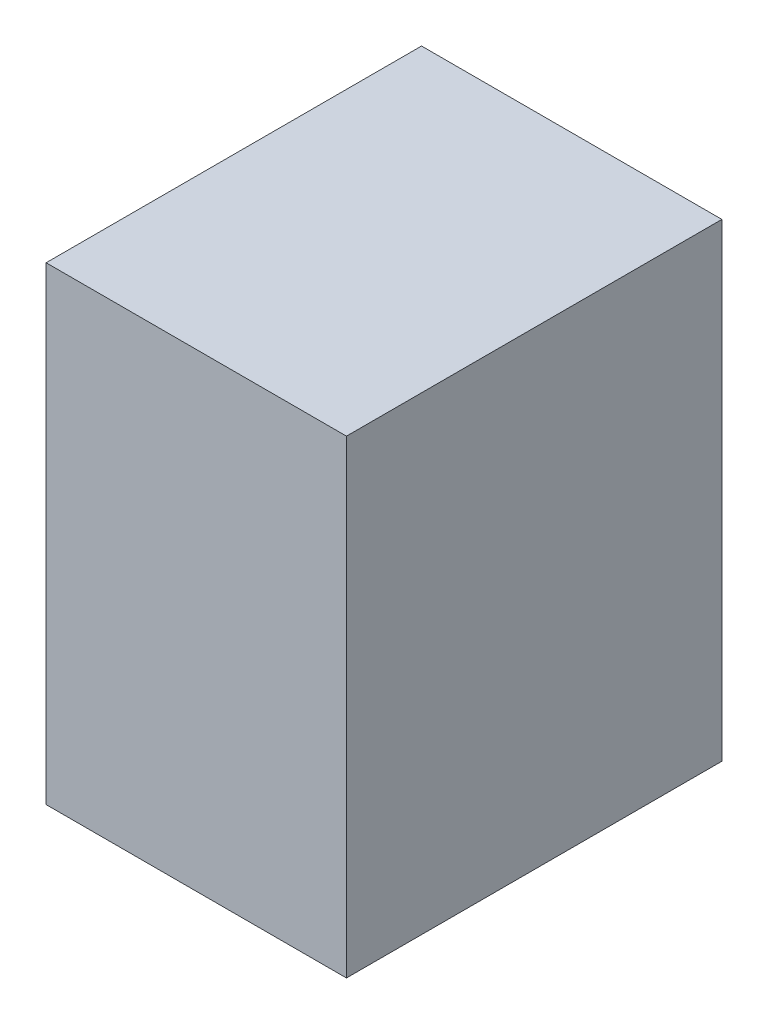
ISO-10303-21;
HEADER;
FILE_DESCRIPTION(('STEP AP214'),'2;1');
FILE_NAME('part.step','',(''),(''),'','','');
FILE_SCHEMA(('AUTOMOTIVE_DESIGN { 1 0 10303 214 1 1 1 1 }'));
ENDSEC;
DATA;
#1=APPLICATION_CONTEXT('core data for automotive mechanical design processes');
#2=APPLICATION_PROTOCOL_DEFINITION('international standard','automotive_design',2000,#1);
#3=PRODUCT_CONTEXT('',#1,'mechanical');
#4=PRODUCT('Part','Part','',(#3));
#5=PRODUCT_RELATED_PRODUCT_CATEGORY('part','',(#4));
#6=PRODUCT_DEFINITION_FORMATION('','',#4);
#7=PRODUCT_DEFINITION_CONTEXT('part definition',#1,'design');
#8=PRODUCT_DEFINITION('design','',#6,#7);
#9=PRODUCT_DEFINITION_SHAPE('','',#8);
#10=(LENGTH_UNIT() NAMED_UNIT(*) SI_UNIT(.MILLI.,.METRE.));
#11=(NAMED_UNIT(*) PLANE_ANGLE_UNIT() SI_UNIT($,.RADIAN.));
#12=(NAMED_UNIT(*) SI_UNIT($,.STERADIAN.) SOLID_ANGLE_UNIT());
#13=UNCERTAINTY_MEASURE_WITH_UNIT(LENGTH_MEASURE(1.E-05),#10,'distance_accuracy_value','');
#14=(GEOMETRIC_REPRESENTATION_CONTEXT(3) GLOBAL_UNCERTAINTY_ASSIGNED_CONTEXT((#13)) GLOBAL_UNIT_ASSIGNED_CONTEXT((#10,
#11,#12)) REPRESENTATION_CONTEXT('',''));
#15=CARTESIAN_POINT('',(0.,0.,0.));
#16=DIRECTION('',(0.,0.,1.));
#17=DIRECTION('',(1.,0.,0.));
#18=AXIS2_PLACEMENT_3D('',#15,#16,#17);
#19=CARTESIAN_POINT('',(16.,25.,-40.));
#20=DIRECTION('',(1.,0.,0.));
#21=DIRECTION('',(0.,1.,0.));
#22=AXIS2_PLACEMENT_3D('',#19,#20,#21);
#23=PLANE('',#22);
#24=DIRECTION('',(0.,1.,0.));
#25=VECTOR('',#24,1.);
#26=CARTESIAN_POINT('',(16.,25.,0.));
#27=LINE('',#26,#25);
#28=CARTESIAN_POINT('',(16.,-25.,0.));
#29=VERTEX_POINT('',#28);
#30=CARTESIAN_POINT('',(16.,25.,0.));
#31=VERTEX_POINT('',#30);
#32=EDGE_CURVE('E101',#29,#31,#27,.T.);
#33=ORIENTED_EDGE('',*,*,#32,.F.);
#34=DIRECTION('',(0.,0.,1.));
#35=VECTOR('',#34,1.);
#36=CARTESIAN_POINT('',(16.,-25.,-40.));
#37=LINE('',#36,#35);
#38=CARTESIAN_POINT('',(16.,-25.,-40.));
#39=VERTEX_POINT('',#38);
#40=EDGE_CURVE('E11',#39,#29,#37,.T.);
#41=ORIENTED_EDGE('',*,*,#40,.F.);
#42=DIRECTION('',(0.,1.,0.));
#43=VECTOR('',#42,1.);
#44=CARTESIAN_POINT('',(16.,25.,-40.));
#45=LINE('',#44,#43);
#46=CARTESIAN_POINT('',(16.,25.,-40.));
#47=VERTEX_POINT('',#46);
#48=EDGE_CURVE('E95',#39,#47,#45,.T.);
#49=ORIENTED_EDGE('',*,*,#48,.T.);
#50=DIRECTION('',(0.,0.,1.));
#51=VECTOR('',#50,1.);
#52=CARTESIAN_POINT('',(16.,25.,-40.));
#53=LINE('',#52,#51);
#54=EDGE_CURVE('E40',#47,#31,#53,.T.);
#55=ORIENTED_EDGE('',*,*,#54,.T.);
#56=EDGE_LOOP('',(#33,#41,#49,#55));
#57=FACE_BOUND('',#56,.T.);
#58=ADVANCED_FACE('F37',(#57),#23,.T.);
#59=CARTESIAN_POINT('',(-16.,-25.,-40.));
#60=DIRECTION('',(0.,-1.,0.));
#61=DIRECTION('',(0.,0.,-1.));
#62=AXIS2_PLACEMENT_3D('',#59,#60,#61);
#63=PLANE('',#62);
#64=DIRECTION('',(1.,0.,0.));
#65=VECTOR('',#64,1.);
#66=CARTESIAN_POINT('',(-16.,-25.,0.));
#67=LINE('',#66,#65);
#68=CARTESIAN_POINT('',(-16.,-25.,0.));
#69=VERTEX_POINT('',#68);
#70=EDGE_CURVE('E97',#69,#29,#67,.T.);
#71=ORIENTED_EDGE('',*,*,#70,.F.);
#72=DIRECTION('',(0.,0.,1.));
#73=VECTOR('',#72,1.);
#74=CARTESIAN_POINT('',(-16.,-25.,-40.));
#75=LINE('',#74,#73);
#76=CARTESIAN_POINT('',(-16.,-25.,-40.));
#77=VERTEX_POINT('',#76);
#78=EDGE_CURVE('E46',#77,#69,#75,.T.);
#79=ORIENTED_EDGE('',*,*,#78,.F.);
#80=DIRECTION('',(1.,0.,0.));
#81=VECTOR('',#80,1.);
#82=CARTESIAN_POINT('',(-16.,-25.,-40.));
#83=LINE('',#82,#81);
#84=EDGE_CURVE('E92',#77,#39,#83,.T.);
#85=ORIENTED_EDGE('',*,*,#84,.T.);
#86=ORIENTED_EDGE('',*,*,#40,.T.);
#87=EDGE_LOOP('',(#71,#79,#85,#86));
#88=FACE_BOUND('',#87,.T.);
#89=ADVANCED_FACE('F111',(#88),#63,.T.);
#90=CARTESIAN_POINT('',(-16.,25.,-40.));
#91=DIRECTION('',(-1.,0.,0.));
#92=DIRECTION('',(0.,-1.,0.));
#93=AXIS2_PLACEMENT_3D('',#90,#91,#92);
#94=PLANE('',#93);
#95=DIRECTION('',(0.,-1.,0.));
#96=VECTOR('',#95,1.);
#97=CARTESIAN_POINT('',(-16.,25.,0.));
#98=LINE('',#97,#96);
#99=CARTESIAN_POINT('',(-16.,25.,0.));
#100=VERTEX_POINT('',#99);
#101=EDGE_CURVE('E87',#100,#69,#98,.T.);
#102=ORIENTED_EDGE('',*,*,#101,.F.);
#103=DIRECTION('',(0.,0.,1.));
#104=VECTOR('',#103,1.);
#105=CARTESIAN_POINT('',(-16.,25.,-40.));
#106=LINE('',#105,#104);
#107=CARTESIAN_POINT('',(-16.,25.,-40.));
#108=VERTEX_POINT('',#107);
#109=EDGE_CURVE('E82',#108,#100,#106,.T.);
#110=ORIENTED_EDGE('',*,*,#109,.F.);
#111=DIRECTION('',(0.,-1.,0.));
#112=VECTOR('',#111,1.);
#113=CARTESIAN_POINT('',(-16.,25.,-40.));
#114=LINE('',#113,#112);
#115=EDGE_CURVE('E85',#108,#77,#114,.T.);
#116=ORIENTED_EDGE('',*,*,#115,.T.);
#117=ORIENTED_EDGE('',*,*,#78,.T.);
#118=EDGE_LOOP('',(#102,#110,#116,#117));
#119=FACE_BOUND('',#118,.T.);
#120=ADVANCED_FACE('F84',(#119),#94,.T.);
#121=CARTESIAN_POINT('',(-16.,25.,-40.));
#122=DIRECTION('',(0.,1.,0.));
#123=DIRECTION('',(0.,0.,1.));
#124=AXIS2_PLACEMENT_3D('',#121,#122,#123);
#125=PLANE('',#124);
#126=DIRECTION('',(-1.,0.,0.));
#127=VECTOR('',#126,1.);
#128=CARTESIAN_POINT('',(-16.,25.,0.));
#129=LINE('',#128,#127);
#130=EDGE_CURVE('E104',#31,#100,#129,.T.);
#131=ORIENTED_EDGE('',*,*,#130,.F.);
#132=ORIENTED_EDGE('',*,*,#54,.F.);
#133=DIRECTION('',(-1.,0.,0.));
#134=VECTOR('',#133,1.);
#135=CARTESIAN_POINT('',(-16.,25.,-40.));
#136=LINE('',#135,#134);
#137=EDGE_CURVE('E91',#47,#108,#136,.T.);
#138=ORIENTED_EDGE('',*,*,#137,.T.);
#139=ORIENTED_EDGE('',*,*,#109,.T.);
#140=EDGE_LOOP('',(#131,#132,#138,#139));
#141=FACE_BOUND('',#140,.T.);
#142=ADVANCED_FACE('F94',(#141),#125,.T.);
#143=CARTESIAN_POINT('',(0.,0.,-40.));
#144=DIRECTION('',(0.,0.,1.));
#145=DIRECTION('',(1.,0.,0.));
#146=AXIS2_PLACEMENT_3D('',#143,#144,#145);
#147=PLANE('',#146);
#148=ORIENTED_EDGE('',*,*,#48,.F.);
#149=ORIENTED_EDGE('',*,*,#84,.F.);
#150=ORIENTED_EDGE('',*,*,#115,.F.);
#151=ORIENTED_EDGE('',*,*,#137,.F.);
#152=EDGE_LOOP('',(#148,#149,#150,#151));
#153=FACE_BOUND('',#152,.T.);
#154=ADVANCED_FACE('F90',(#153),#147,.F.);
#155=CARTESIAN_POINT('',(0.,0.,0.));
#156=DIRECTION('',(0.,0.,1.));
#157=DIRECTION('',(1.,0.,0.));
#158=AXIS2_PLACEMENT_3D('',#155,#156,#157);
#159=PLANE('',#158);
#160=ORIENTED_EDGE('',*,*,#32,.T.);
#161=ORIENTED_EDGE('',*,*,#130,.T.);
#162=ORIENTED_EDGE('',*,*,#101,.T.);
#163=ORIENTED_EDGE('',*,*,#70,.T.);
#164=EDGE_LOOP('',(#160,#161,#162,#163));
#165=FACE_BOUND('',#164,.T.);
#166=ADVANCED_FACE('F110',(#165),#159,.T.);
#167=CLOSED_SHELL('',(#58,#89,#120,#142,#154,#166));
#168=MANIFOLD_SOLID_BREP('B2',#167);
#169=ADVANCED_BREP_SHAPE_REPRESENTATION('',(#18,#168),#14);
#170=SHAPE_DEFINITION_REPRESENTATION(#9,#169);
ENDSEC;
END-ISO-10303-21;
